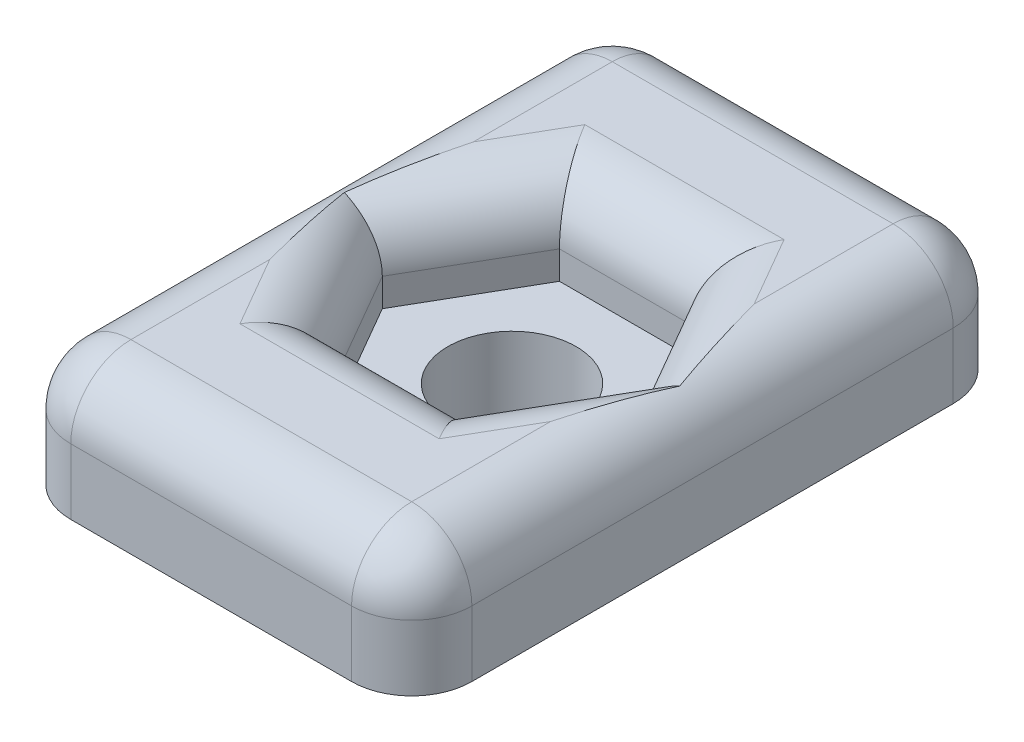
ISO-10303-21;
HEADER;
FILE_DESCRIPTION(('STEP AP214'),'2;1');
FILE_NAME('part.step','',(''),(''),'','','');
FILE_SCHEMA(('AUTOMOTIVE_DESIGN { 1 0 10303 214 1 1 1 1 }'));
ENDSEC;
DATA;
#1=APPLICATION_CONTEXT('core data for automotive mechanical design processes');
#2=APPLICATION_PROTOCOL_DEFINITION('international standard','automotive_design',2000,#1);
#3=PRODUCT_CONTEXT('',#1,'mechanical');
#4=PRODUCT('Part','Part','',(#3));
#5=PRODUCT_RELATED_PRODUCT_CATEGORY('part','',(#4));
#6=PRODUCT_DEFINITION_FORMATION('','',#4);
#7=PRODUCT_DEFINITION_CONTEXT('part definition',#1,'design');
#8=PRODUCT_DEFINITION('design','',#6,#7);
#9=PRODUCT_DEFINITION_SHAPE('','',#8);
#10=(LENGTH_UNIT() NAMED_UNIT(*) SI_UNIT(.MILLI.,.METRE.));
#11=(NAMED_UNIT(*) PLANE_ANGLE_UNIT() SI_UNIT($,.RADIAN.));
#12=(NAMED_UNIT(*) SI_UNIT($,.STERADIAN.) SOLID_ANGLE_UNIT());
#13=UNCERTAINTY_MEASURE_WITH_UNIT(LENGTH_MEASURE(1.E-05),#10,'distance_accuracy_value','');
#14=(GEOMETRIC_REPRESENTATION_CONTEXT(3) GLOBAL_UNCERTAINTY_ASSIGNED_CONTEXT((#13)) GLOBAL_UNIT_ASSIGNED_CONTEXT((#10,
#11,#12)) REPRESENTATION_CONTEXT('',''));
#15=CARTESIAN_POINT('',(0.,0.,0.));
#16=DIRECTION('',(0.,0.,1.));
#17=DIRECTION('',(1.,0.,0.));
#18=AXIS2_PLACEMENT_3D('',#15,#16,#17);
#19=CARTESIAN_POINT('',(0.,4.,0.));
#20=DIRECTION('',(0.,-1.,0.));
#21=DIRECTION('',(0.,0.,-1.));
#22=AXIS2_PLACEMENT_3D('',#19,#20,#21);
#23=PLANE('',#22);
#24=DIRECTION('',(1.,0.,0.));
#25=VECTOR('',#24,1.);
#26=CARTESIAN_POINT('',(0.,4.,-1.5));
#27=LINE('',#26,#25);
#28=CARTESIAN_POINT('',(1.5,4.,-1.5));
#29=VERTEX_POINT('',#28);
#30=CARTESIAN_POINT('',(8.5,4.,-1.5));
#31=VERTEX_POINT('',#30);
#32=EDGE_CURVE('E304',#29,#31,#27,.T.);
#33=ORIENTED_EDGE('',*,*,#32,.T.);
#34=DIRECTION('',(0.,0.,-1.));
#35=VECTOR('',#34,1.);
#36=CARTESIAN_POINT('',(8.5,4.,0.));
#37=LINE('',#36,#35);
#38=CARTESIAN_POINT('',(8.5,4.,-4.96217782649107));
#39=VERTEX_POINT('',#38);
#40=EDGE_CURVE('E307',#31,#39,#37,.T.);
#41=ORIENTED_EDGE('',*,*,#40,.T.);
#42=DIRECTION('',(0.5,0.,-0.866025403784439));
#43=VECTOR('',#42,1.);
#44=CARTESIAN_POINT('',(4.22631397208145,4.,2.4400635094611));
#45=LINE('',#44,#43);
#46=CARTESIAN_POINT('',(7.48260615751539,4.,-3.2));
#47=VERTEX_POINT('',#46);
#48=EDGE_CURVE('E292',#39,#47,#45,.F.);
#49=ORIENTED_EDGE('',*,*,#48,.T.);
#50=DIRECTION('',(1.,0.,0.));
#51=VECTOR('',#50,1.);
#52=CARTESIAN_POINT('',(0.,4.,-3.2));
#53=LINE('',#52,#51);
#54=CARTESIAN_POINT('',(2.51739384248461,4.,-3.2));
#55=VERTEX_POINT('',#54);
#56=EDGE_CURVE('E295',#47,#55,#53,.F.);
#57=ORIENTED_EDGE('',*,*,#56,.T.);
#58=DIRECTION('',(0.5,0.,0.866025403784439));
#59=VECTOR('',#58,1.);
#60=CARTESIAN_POINT('',(3.27368602791856,4.,-1.8900635094611));
#61=LINE('',#60,#59);
#62=CARTESIAN_POINT('',(1.5,4.,-4.96217782649107));
#63=VERTEX_POINT('',#62);
#64=EDGE_CURVE('E298',#55,#63,#61,.F.);
#65=ORIENTED_EDGE('',*,*,#64,.T.);
#66=DIRECTION('',(0.,0.,1.));
#67=VECTOR('',#66,1.);
#68=CARTESIAN_POINT('',(1.5,4.,0.));
#69=LINE('',#68,#67);
#70=EDGE_CURVE('E301',#63,#29,#69,.T.);
#71=ORIENTED_EDGE('',*,*,#70,.T.);
#72=EDGE_LOOP('',(#33,#41,#49,#57,#65,#71));
#73=FACE_BOUND('',#72,.T.);
#74=ADVANCED_FACE('F49',(#73),#23,.F.);
#75=CARTESIAN_POINT('',(0.,4.,0.));
#76=DIRECTION('',(1.,0.,0.));
#77=DIRECTION('',(0.,0.,-1.));
#78=AXIS2_PLACEMENT_3D('',#75,#76,#77);
#79=PLANE('',#78);
#80=DIRECTION('',(0.,-1.,0.));
#81=VECTOR('',#80,1.);
#82=CARTESIAN_POINT('',(0.,4.,-13.5));
#83=LINE('',#82,#81);
#84=CARTESIAN_POINT('',(0.,2.5,-13.5));
#85=VERTEX_POINT('',#84);
#86=CARTESIAN_POINT('',(0.,0.866025403784441,-13.5));
#87=VERTEX_POINT('',#86);
#88=EDGE_CURVE('E342',#85,#87,#83,.T.);
#89=ORIENTED_EDGE('',*,*,#88,.T.);
#90=DIRECTION('',(0.,0.,1.));
#91=VECTOR('',#90,1.);
#92=CARTESIAN_POINT('',(0.,0.866025403784441,-1.5));
#93=LINE('',#92,#91);
#94=CARTESIAN_POINT('',(0.,0.866025403784441,-1.5));
#95=VERTEX_POINT('',#94);
#96=EDGE_CURVE('E11',#87,#95,#93,.T.);
#97=ORIENTED_EDGE('',*,*,#96,.T.);
#98=DIRECTION('',(0.,-1.,0.));
#99=VECTOR('',#98,1.);
#100=CARTESIAN_POINT('',(0.,4.,-1.5));
#101=LINE('',#100,#99);
#102=CARTESIAN_POINT('',(0.,2.5,-1.5));
#103=VERTEX_POINT('',#102);
#104=EDGE_CURVE('E348',#95,#103,#101,.F.);
#105=ORIENTED_EDGE('',*,*,#104,.T.);
#106=DIRECTION('',(0.,0.,1.));
#107=VECTOR('',#106,1.);
#108=CARTESIAN_POINT('',(0.,2.5,0.));
#109=LINE('',#108,#107);
#110=EDGE_CURVE('E345',#103,#85,#109,.F.);
#111=ORIENTED_EDGE('',*,*,#110,.T.);
#112=EDGE_LOOP('',(#89,#97,#105,#111));
#113=FACE_BOUND('',#112,.T.);
#114=ADVANCED_FACE('F549',(#113),#79,.F.);
#115=CARTESIAN_POINT('',(0.,4.,0.));
#116=DIRECTION('',(0.,0.,-1.));
#117=DIRECTION('',(-1.,0.,0.));
#118=AXIS2_PLACEMENT_3D('',#115,#116,#117);
#119=PLANE('',#118);
#120=DIRECTION('',(0.,-1.,0.));
#121=VECTOR('',#120,1.);
#122=CARTESIAN_POINT('',(1.5,4.,0.));
#123=LINE('',#122,#121);
#124=CARTESIAN_POINT('',(1.5,2.5,0.));
#125=VERTEX_POINT('',#124);
#126=CARTESIAN_POINT('',(1.5,0.866025403784441,0.));
#127=VERTEX_POINT('',#126);
#128=EDGE_CURVE('E332',#125,#127,#123,.T.);
#129=ORIENTED_EDGE('',*,*,#128,.T.);
#130=DIRECTION('',(1.,0.,0.));
#131=VECTOR('',#130,1.);
#132=CARTESIAN_POINT('',(8.5,0.866025403784441,0.));
#133=LINE('',#132,#131);
#134=CARTESIAN_POINT('',(8.5,0.866025403784441,0.));
#135=VERTEX_POINT('',#134);
#136=EDGE_CURVE('E478',#127,#135,#133,.T.);
#137=ORIENTED_EDGE('',*,*,#136,.T.);
#138=DIRECTION('',(0.,-1.,0.));
#139=VECTOR('',#138,1.);
#140=CARTESIAN_POINT('',(8.5,4.,0.));
#141=LINE('',#140,#139);
#142=CARTESIAN_POINT('',(8.5,2.5,0.));
#143=VERTEX_POINT('',#142);
#144=EDGE_CURVE('E339',#135,#143,#141,.F.);
#145=ORIENTED_EDGE('',*,*,#144,.T.);
#146=DIRECTION('',(1.,0.,0.));
#147=VECTOR('',#146,1.);
#148=CARTESIAN_POINT('',(0.,2.5,0.));
#149=LINE('',#148,#147);
#150=EDGE_CURVE('E336',#143,#125,#149,.F.);
#151=ORIENTED_EDGE('',*,*,#150,.T.);
#152=EDGE_LOOP('',(#129,#137,#145,#151));
#153=FACE_BOUND('',#152,.T.);
#154=ADVANCED_FACE('F529',(#153),#119,.F.);
#155=CARTESIAN_POINT('',(10.,4.,0.));
#156=DIRECTION('',(-1.,0.,0.));
#157=DIRECTION('',(0.,0.,1.));
#158=AXIS2_PLACEMENT_3D('',#155,#156,#157);
#159=PLANE('',#158);
#160=DIRECTION('',(0.,-1.,0.));
#161=VECTOR('',#160,1.);
#162=CARTESIAN_POINT('',(10.,4.,-1.5));
#163=LINE('',#162,#161);
#164=CARTESIAN_POINT('',(10.,2.5,-1.5));
#165=VERTEX_POINT('',#164);
#166=CARTESIAN_POINT('',(10.,0.866025403784441,-1.5));
#167=VERTEX_POINT('',#166);
#168=EDGE_CURVE('E328',#165,#167,#163,.T.);
#169=ORIENTED_EDGE('',*,*,#168,.T.);
#170=DIRECTION('',(0.,0.,-1.));
#171=VECTOR('',#170,1.);
#172=CARTESIAN_POINT('',(10.,0.866025403784441,-13.5));
#173=LINE('',#172,#171);
#174=CARTESIAN_POINT('',(10.,0.866025403784441,-13.5));
#175=VERTEX_POINT('',#174);
#176=EDGE_CURVE('E369',#167,#175,#173,.T.);
#177=ORIENTED_EDGE('',*,*,#176,.T.);
#178=DIRECTION('',(0.,-1.,0.));
#179=VECTOR('',#178,1.);
#180=CARTESIAN_POINT('',(10.,4.,-13.5));
#181=LINE('',#180,#179);
#182=CARTESIAN_POINT('',(10.,2.5,-13.5));
#183=VERTEX_POINT('',#182);
#184=EDGE_CURVE('E322',#175,#183,#181,.F.);
#185=ORIENTED_EDGE('',*,*,#184,.T.);
#186=DIRECTION('',(0.,0.,-1.));
#187=VECTOR('',#186,1.);
#188=CARTESIAN_POINT('',(10.,2.5,0.));
#189=LINE('',#188,#187);
#190=EDGE_CURVE('E325',#183,#165,#189,.F.);
#191=ORIENTED_EDGE('',*,*,#190,.T.);
#192=EDGE_LOOP('',(#169,#177,#185,#191));
#193=FACE_BOUND('',#192,.T.);
#194=ADVANCED_FACE('F603',(#193),#159,.F.);
#195=CARTESIAN_POINT('',(0.,4.,-15.));
#196=DIRECTION('',(0.,0.,1.));
#197=DIRECTION('',(1.,0.,0.));
#198=AXIS2_PLACEMENT_3D('',#195,#196,#197);
#199=PLANE('',#198);
#200=DIRECTION('',(0.,-1.,0.));
#201=VECTOR('',#200,1.);
#202=CARTESIAN_POINT('',(8.5,4.,-15.));
#203=LINE('',#202,#201);
#204=CARTESIAN_POINT('',(8.5,2.5,-15.));
#205=VERTEX_POINT('',#204);
#206=CARTESIAN_POINT('',(8.5,0.866025403784441,-15.));
#207=VERTEX_POINT('',#206);
#208=EDGE_CURVE('E311',#205,#207,#203,.T.);
#209=ORIENTED_EDGE('',*,*,#208,.T.);
#210=DIRECTION('',(-1.,0.,0.));
#211=VECTOR('',#210,1.);
#212=CARTESIAN_POINT('',(1.5,0.866025403784441,-15.));
#213=LINE('',#212,#211);
#214=CARTESIAN_POINT('',(1.5,0.866025403784441,-15.));
#215=VERTEX_POINT('',#214);
#216=EDGE_CURVE('E475',#207,#215,#213,.T.);
#217=ORIENTED_EDGE('',*,*,#216,.T.);
#218=DIRECTION('',(0.,-1.,0.));
#219=VECTOR('',#218,1.);
#220=CARTESIAN_POINT('',(1.5,4.,-15.));
#221=LINE('',#220,#219);
#222=CARTESIAN_POINT('',(1.5,2.5,-15.));
#223=VERTEX_POINT('',#222);
#224=EDGE_CURVE('E319',#215,#223,#221,.F.);
#225=ORIENTED_EDGE('',*,*,#224,.T.);
#226=DIRECTION('',(-1.,0.,0.));
#227=VECTOR('',#226,1.);
#228=CARTESIAN_POINT('',(0.,2.5,-15.));
#229=LINE('',#228,#227);
#230=EDGE_CURVE('E315',#223,#205,#229,.F.);
#231=ORIENTED_EDGE('',*,*,#230,.T.);
#232=EDGE_LOOP('',(#209,#217,#225,#231));
#233=FACE_BOUND('',#232,.T.);
#234=ADVANCED_FACE('F566',(#233),#199,.F.);
#235=DIRECTION('',(-1.,0.,0.));
#236=VECTOR('',#235,1.);
#237=CARTESIAN_POINT('',(0.,4.,-13.5));
#238=LINE('',#237,#236);
#239=CARTESIAN_POINT('',(8.5,4.,-13.5));
#240=VERTEX_POINT('',#239);
#241=CARTESIAN_POINT('',(1.5,4.,-13.5));
#242=VERTEX_POINT('',#241);
#243=EDGE_CURVE('E282',#240,#242,#238,.T.);
#244=ORIENTED_EDGE('',*,*,#243,.T.);
#245=DIRECTION('',(0.,0.,1.));
#246=VECTOR('',#245,1.);
#247=CARTESIAN_POINT('',(1.5,4.,0.));
#248=LINE('',#247,#246);
#249=CARTESIAN_POINT('',(1.5,4.,-10.0378221735089));
#250=VERTEX_POINT('',#249);
#251=EDGE_CURVE('E289',#242,#250,#248,.T.);
#252=ORIENTED_EDGE('',*,*,#251,.T.);
#253=DIRECTION('',(-0.5,0.,0.866025403784439));
#254=VECTOR('',#253,1.);
#255=CARTESIAN_POINT('',(-3.22150450046473,4.,-1.8599364905389));
#256=LINE('',#255,#254);
#257=CARTESIAN_POINT('',(2.51739384248461,4.,-11.8));
#258=VERTEX_POINT('',#257);
#259=EDGE_CURVE('E286',#250,#258,#256,.F.);
#260=ORIENTED_EDGE('',*,*,#259,.T.);
#261=DIRECTION('',(-1.,0.,0.));
#262=VECTOR('',#261,1.);
#263=CARTESIAN_POINT('',(0.,4.,-11.8));
#264=LINE('',#263,#262);
#265=CARTESIAN_POINT('',(7.48260615751539,4.,-11.8));
#266=VERTEX_POINT('',#265);
#267=EDGE_CURVE('E276',#258,#266,#264,.F.);
#268=ORIENTED_EDGE('',*,*,#267,.T.);
#269=DIRECTION('',(-0.5,0.,-0.866025403784439));
#270=VECTOR('',#269,1.);
#271=CARTESIAN_POINT('',(10.7215045004647,4.,-6.19006350946109));
#272=LINE('',#271,#270);
#273=CARTESIAN_POINT('',(8.5,4.,-10.0378221735089));
#274=VERTEX_POINT('',#273);
#275=EDGE_CURVE('E259',#266,#274,#272,.F.);
#276=ORIENTED_EDGE('',*,*,#275,.T.);
#277=DIRECTION('',(0.,0.,-1.));
#278=VECTOR('',#277,1.);
#279=CARTESIAN_POINT('',(8.5,4.,0.));
#280=LINE('',#279,#278);
#281=EDGE_CURVE('E279',#274,#240,#280,.T.);
#282=ORIENTED_EDGE('',*,*,#281,.T.);
#283=EDGE_LOOP('',(#244,#252,#260,#268,#276,#282));
#284=FACE_BOUND('',#283,.T.);
#285=ADVANCED_FACE('F588',(#284),#23,.F.);
#286=CARTESIAN_POINT('',(0.,0.,0.));
#287=DIRECTION('',(0.,-1.,0.));
#288=DIRECTION('',(0.,0.,-1.));
#289=AXIS2_PLACEMENT_3D('',#286,#287,#288);
#290=PLANE('',#289);
#291=DIRECTION('',(1.,0.,0.));
#292=VECTOR('',#291,1.);
#293=CARTESIAN_POINT('',(8.5,0.,-13.5));
#294=LINE('',#293,#292);
#295=CARTESIAN_POINT('',(1.50000000000001,0.,-13.5));
#296=VERTEX_POINT('',#295);
#297=CARTESIAN_POINT('',(8.5,0.,-13.5));
#298=VERTEX_POINT('',#297);
#299=EDGE_CURVE('E462',#296,#298,#294,.T.);
#300=ORIENTED_EDGE('',*,*,#299,.T.);
#301=DIRECTION('',(0.,0.,1.));
#302=VECTOR('',#301,1.);
#303=CARTESIAN_POINT('',(8.49999999999999,0.,-1.5));
#304=LINE('',#303,#302);
#305=CARTESIAN_POINT('',(8.5,0.,-1.50000000000001));
#306=VERTEX_POINT('',#305);
#307=EDGE_CURVE('E465',#298,#306,#304,.T.);
#308=ORIENTED_EDGE('',*,*,#307,.T.);
#309=DIRECTION('',(-1.,0.,0.));
#310=VECTOR('',#309,1.);
#311=CARTESIAN_POINT('',(1.5,0.,-1.50000000000001));
#312=LINE('',#311,#310);
#313=CARTESIAN_POINT('',(1.50000000000001,0.,-1.5));
#314=VERTEX_POINT('',#313);
#315=EDGE_CURVE('E459',#306,#314,#312,.T.);
#316=ORIENTED_EDGE('',*,*,#315,.T.);
#317=DIRECTION('',(0.,0.,-1.));
#318=VECTOR('',#317,1.);
#319=CARTESIAN_POINT('',(1.50000000000001,0.,-13.5));
#320=LINE('',#319,#318);
#321=EDGE_CURVE('E456',#314,#296,#320,.T.);
#322=ORIENTED_EDGE('',*,*,#321,.T.);
#323=EDGE_LOOP('',(#300,#308,#316,#322));
#324=FACE_BOUND('',#323,.T.);
#325=CARTESIAN_POINT('',(5.,0.,-7.5));
#326=DIRECTION('',(0.,1.,0.));
#327=DIRECTION('',(0.,0.,1.));
#328=AXIS2_PLACEMENT_3D('',#325,#326,#327);
#329=CIRCLE('',#328,1.6);
#330=CARTESIAN_POINT('',(5.,0.,-5.9));
#331=VERTEX_POINT('',#330);
#332=EDGE_CURVE('E237',#331,#331,#329,.T.);
#333=ORIENTED_EDGE('',*,*,#332,.T.);
#334=EDGE_LOOP('',(#333));
#335=FACE_BOUND('',#334,.T.);
#336=ADVANCED_FACE('F576',(#324,#335),#290,.T.);
#337=CARTESIAN_POINT('',(6.61658075373095,1.8,-4.7));
#338=DIRECTION('',(0.866025403784439,0.,0.5));
#339=DIRECTION('',(0.5,0.,-0.866025403784439));
#340=AXIS2_PLACEMENT_3D('',#337,#338,#339);
#341=PLANE('',#340);
#342=DIRECTION('',(0.,1.,0.));
#343=VECTOR('',#342,1.);
#344=CARTESIAN_POINT('',(6.61658075373095,1.8,-4.7));
#345=LINE('',#344,#343);
#346=CARTESIAN_POINT('',(6.61658075373095,1.8,-4.7));
#347=VERTEX_POINT('',#346);
#348=CARTESIAN_POINT('',(6.61658075373095,2.5,-4.7));
#349=VERTEX_POINT('',#348);
#350=EDGE_CURVE('E256',#347,#349,#345,.T.);
#351=ORIENTED_EDGE('',*,*,#350,.T.);
#352=DIRECTION('',(0.5,0.,-0.866025403784439));
#353=VECTOR('',#352,1.);
#354=CARTESIAN_POINT('',(6.61658075373095,2.5,-4.7));
#355=LINE('',#354,#353);
#356=CARTESIAN_POINT('',(8.2331615074619,2.5,-7.5));
#357=VERTEX_POINT('',#356);
#358=EDGE_CURVE('E216',#349,#357,#355,.T.);
#359=ORIENTED_EDGE('',*,*,#358,.T.);
#360=DIRECTION('',(0.,1.,0.));
#361=VECTOR('',#360,1.);
#362=CARTESIAN_POINT('',(8.2331615074619,1.8,-7.5));
#363=LINE('',#362,#361);
#364=CARTESIAN_POINT('',(8.2331615074619,1.8,-7.5));
#365=VERTEX_POINT('',#364);
#366=EDGE_CURVE('E208',#365,#357,#363,.T.);
#367=ORIENTED_EDGE('',*,*,#366,.F.);
#368=DIRECTION('',(0.5,0.,-0.866025403784439));
#369=VECTOR('',#368,1.);
#370=CARTESIAN_POINT('',(6.61658075373095,1.8,-4.7));
#371=LINE('',#370,#369);
#372=EDGE_CURVE('E213',#347,#365,#371,.T.);
#373=ORIENTED_EDGE('',*,*,#372,.F.);
#374=EDGE_LOOP('',(#351,#359,#367,#373));
#375=FACE_BOUND('',#374,.T.);
#376=ADVANCED_FACE('F211',(#375),#341,.F.);
#377=CARTESIAN_POINT('',(3.38341924626905,1.8,-4.7));
#378=DIRECTION('',(0.,0.,1.));
#379=DIRECTION('',(1.,0.,0.));
#380=AXIS2_PLACEMENT_3D('',#377,#378,#379);
#381=PLANE('',#380);
#382=DIRECTION('',(0.,1.,0.));
#383=VECTOR('',#382,1.);
#384=CARTESIAN_POINT('',(3.38341924626905,1.8,-4.7));
#385=LINE('',#384,#383);
#386=CARTESIAN_POINT('',(3.38341924626905,1.8,-4.7));
#387=VERTEX_POINT('',#386);
#388=CARTESIAN_POINT('',(3.38341924626905,2.5,-4.7));
#389=VERTEX_POINT('',#388);
#390=EDGE_CURVE('E260',#387,#389,#385,.T.);
#391=ORIENTED_EDGE('',*,*,#390,.T.);
#392=DIRECTION('',(1.,0.,0.));
#393=VECTOR('',#392,1.);
#394=CARTESIAN_POINT('',(3.38341924626905,2.5,-4.7));
#395=LINE('',#394,#393);
#396=EDGE_CURVE('E361',#389,#349,#395,.T.);
#397=ORIENTED_EDGE('',*,*,#396,.T.);
#398=ORIENTED_EDGE('',*,*,#350,.F.);
#399=DIRECTION('',(1.,0.,0.));
#400=VECTOR('',#399,1.);
#401=CARTESIAN_POINT('',(3.38341924626905,1.8,-4.7));
#402=LINE('',#401,#400);
#403=EDGE_CURVE('E221',#387,#347,#402,.T.);
#404=ORIENTED_EDGE('',*,*,#403,.F.);
#405=EDGE_LOOP('',(#391,#397,#398,#404));
#406=FACE_BOUND('',#405,.T.);
#407=ADVANCED_FACE('F847',(#406),#381,.F.);
#408=CARTESIAN_POINT('',(1.76683849253809,1.8,-7.5));
#409=DIRECTION('',(-0.866025403784439,0.,0.5));
#410=DIRECTION('',(0.5,0.,0.866025403784439));
#411=AXIS2_PLACEMENT_3D('',#408,#409,#410);
#412=PLANE('',#411);
#413=DIRECTION('',(0.,1.,0.));
#414=VECTOR('',#413,1.);
#415=CARTESIAN_POINT('',(1.76683849253809,1.8,-7.5));
#416=LINE('',#415,#414);
#417=CARTESIAN_POINT('',(1.76683849253809,1.8,-7.5));
#418=VERTEX_POINT('',#417);
#419=CARTESIAN_POINT('',(1.76683849253809,2.5,-7.5));
#420=VERTEX_POINT('',#419);
#421=EDGE_CURVE('E264',#418,#420,#416,.T.);
#422=ORIENTED_EDGE('',*,*,#421,.T.);
#423=DIRECTION('',(0.5,0.,0.866025403784439));
#424=VECTOR('',#423,1.);
#425=CARTESIAN_POINT('',(1.76683849253809,2.5,-7.5));
#426=LINE('',#425,#424);
#427=EDGE_CURVE('E358',#420,#389,#426,.T.);
#428=ORIENTED_EDGE('',*,*,#427,.T.);
#429=ORIENTED_EDGE('',*,*,#390,.F.);
#430=DIRECTION('',(0.5,0.,0.866025403784439));
#431=VECTOR('',#430,1.);
#432=CARTESIAN_POINT('',(1.76683849253809,1.8,-7.5));
#433=LINE('',#432,#431);
#434=EDGE_CURVE('E251',#418,#387,#433,.T.);
#435=ORIENTED_EDGE('',*,*,#434,.F.);
#436=EDGE_LOOP('',(#422,#428,#429,#435));
#437=FACE_BOUND('',#436,.T.);
#438=ADVANCED_FACE('F854',(#437),#412,.F.);
#439=CARTESIAN_POINT('',(3.38341924626905,1.8,-10.3));
#440=DIRECTION('',(-0.866025403784439,0.,-0.5));
#441=DIRECTION('',(-0.5,0.,0.866025403784439));
#442=AXIS2_PLACEMENT_3D('',#439,#440,#441);
#443=PLANE('',#442);
#444=DIRECTION('',(0.,1.,0.));
#445=VECTOR('',#444,1.);
#446=CARTESIAN_POINT('',(3.38341924626905,1.8,-10.3));
#447=LINE('',#446,#445);
#448=CARTESIAN_POINT('',(3.38341924626905,1.8,-10.3));
#449=VERTEX_POINT('',#448);
#450=CARTESIAN_POINT('',(3.38341924626905,2.5,-10.3));
#451=VERTEX_POINT('',#450);
#452=EDGE_CURVE('E268',#449,#451,#447,.T.);
#453=ORIENTED_EDGE('',*,*,#452,.T.);
#454=DIRECTION('',(-0.5,0.,0.866025403784439));
#455=VECTOR('',#454,1.);
#456=CARTESIAN_POINT('',(3.38341924626905,2.5,-10.3));
#457=LINE('',#456,#455);
#458=EDGE_CURVE('E355',#451,#420,#457,.T.);
#459=ORIENTED_EDGE('',*,*,#458,.T.);
#460=ORIENTED_EDGE('',*,*,#421,.F.);
#461=DIRECTION('',(-0.5,0.,0.866025403784439));
#462=VECTOR('',#461,1.);
#463=CARTESIAN_POINT('',(3.38341924626905,1.8,-10.3));
#464=LINE('',#463,#462);
#465=EDGE_CURVE('E247',#449,#418,#464,.T.);
#466=ORIENTED_EDGE('',*,*,#465,.F.);
#467=EDGE_LOOP('',(#453,#459,#460,#466));
#468=FACE_BOUND('',#467,.T.);
#469=ADVANCED_FACE('F863',(#468),#443,.F.);
#470=CARTESIAN_POINT('',(6.61658075373095,1.8,-10.3));
#471=DIRECTION('',(0.,0.,-1.));
#472=DIRECTION('',(-1.,0.,0.));
#473=AXIS2_PLACEMENT_3D('',#470,#471,#472);
#474=PLANE('',#473);
#475=DIRECTION('',(0.,1.,0.));
#476=VECTOR('',#475,1.);
#477=CARTESIAN_POINT('',(6.61658075373095,1.8,-10.3));
#478=LINE('',#477,#476);
#479=CARTESIAN_POINT('',(6.61658075373095,1.8,-10.3));
#480=VERTEX_POINT('',#479);
#481=CARTESIAN_POINT('',(6.61658075373095,2.5,-10.3));
#482=VERTEX_POINT('',#481);
#483=EDGE_CURVE('E220',#480,#482,#478,.T.);
#484=ORIENTED_EDGE('',*,*,#483,.T.);
#485=DIRECTION('',(-1.,0.,0.));
#486=VECTOR('',#485,1.);
#487=CARTESIAN_POINT('',(6.61658075373095,2.5,-10.3));
#488=LINE('',#487,#486);
#489=EDGE_CURVE('E351',#482,#451,#488,.T.);
#490=ORIENTED_EDGE('',*,*,#489,.T.);
#491=ORIENTED_EDGE('',*,*,#452,.F.);
#492=DIRECTION('',(-1.,0.,0.));
#493=VECTOR('',#492,1.);
#494=CARTESIAN_POINT('',(6.61658075373095,1.8,-10.3));
#495=LINE('',#494,#493);
#496=EDGE_CURVE('E231',#480,#449,#495,.T.);
#497=ORIENTED_EDGE('',*,*,#496,.F.);
#498=EDGE_LOOP('',(#484,#490,#491,#497));
#499=FACE_BOUND('',#498,.T.);
#500=ADVANCED_FACE('F872',(#499),#474,.F.);
#501=CARTESIAN_POINT('',(8.2331615074619,1.8,-7.5));
#502=DIRECTION('',(0.866025403784439,0.,-0.5));
#503=DIRECTION('',(-0.5,0.,-0.866025403784439));
#504=AXIS2_PLACEMENT_3D('',#501,#502,#503);
#505=PLANE('',#504);
#506=ORIENTED_EDGE('',*,*,#366,.T.);
#507=DIRECTION('',(-0.5,0.,-0.866025403784439));
#508=VECTOR('',#507,1.);
#509=CARTESIAN_POINT('',(8.2331615074619,2.5,-7.5));
#510=LINE('',#509,#508);
#511=EDGE_CURVE('E366',#357,#482,#510,.T.);
#512=ORIENTED_EDGE('',*,*,#511,.T.);
#513=ORIENTED_EDGE('',*,*,#483,.F.);
#514=DIRECTION('',(-0.5,0.,-0.866025403784439));
#515=VECTOR('',#514,1.);
#516=CARTESIAN_POINT('',(8.2331615074619,1.8,-7.5));
#517=LINE('',#516,#515);
#518=EDGE_CURVE('E224',#365,#480,#517,.T.);
#519=ORIENTED_EDGE('',*,*,#518,.F.);
#520=EDGE_LOOP('',(#506,#512,#513,#519));
#521=FACE_BOUND('',#520,.T.);
#522=ADVANCED_FACE('F225',(#521),#505,.F.);
#523=CARTESIAN_POINT('',(0.,1.8,0.));
#524=DIRECTION('',(0.,1.,0.));
#525=DIRECTION('',(0.,0.,1.));
#526=AXIS2_PLACEMENT_3D('',#523,#524,#525);
#527=PLANE('',#526);
#528=CARTESIAN_POINT('',(5.,1.8,-7.5));
#529=DIRECTION('',(0.,1.,0.));
#530=DIRECTION('',(0.,0.,1.));
#531=AXIS2_PLACEMENT_3D('',#528,#529,#530);
#532=CIRCLE('',#531,1.59999999999999);
#533=CARTESIAN_POINT('',(5.,1.8,-5.90000000000001));
#534=VERTEX_POINT('',#533);
#535=EDGE_CURVE('E241',#534,#534,#532,.T.);
#536=ORIENTED_EDGE('',*,*,#535,.F.);
#537=EDGE_LOOP('',(#536));
#538=FACE_BOUND('',#537,.T.);
#539=ORIENTED_EDGE('',*,*,#372,.T.);
#540=ORIENTED_EDGE('',*,*,#518,.T.);
#541=ORIENTED_EDGE('',*,*,#496,.T.);
#542=ORIENTED_EDGE('',*,*,#465,.T.);
#543=ORIENTED_EDGE('',*,*,#434,.T.);
#544=ORIENTED_EDGE('',*,*,#403,.T.);
#545=EDGE_LOOP('',(#539,#540,#541,#542,#543,#544));
#546=FACE_BOUND('',#545,.T.);
#547=ADVANCED_FACE('F233',(#538,#546),#527,.T.);
#548=CARTESIAN_POINT('',(5.,1.8,-7.5));
#549=DIRECTION('',(0.,1.,0.));
#550=DIRECTION('',(0.,0.,1.));
#551=AXIS2_PLACEMENT_3D('',#548,#549,#550);
#552=CYLINDRICAL_SURFACE('',#551,1.59999999999999);
#553=ORIENTED_EDGE('',*,*,#332,.F.);
#554=EDGE_LOOP('',(#553));
#555=FACE_BOUND('',#554,.T.);
#556=ORIENTED_EDGE('',*,*,#535,.T.);
#557=EDGE_LOOP('',(#556));
#558=FACE_BOUND('',#557,.T.);
#559=ADVANCED_FACE('F706',(#555,#558),#552,.F.);
#560=CARTESIAN_POINT('',(6.61658075373095,2.5,-11.8));
#561=DIRECTION('',(-1.,0.,0.));
#562=DIRECTION('',(0.,0.,1.));
#563=AXIS2_PLACEMENT_3D('',#560,#561,#562);
#564=CYLINDRICAL_SURFACE('',#563,1.5);
#565=CARTESIAN_POINT('',(2.51739384248461,2.5,-11.8));
#566=DIRECTION('',(-0.866025403784439,0.,0.5));
#567=DIRECTION('',(-0.5,0.,-0.866025403784439));
#568=AXIS2_PLACEMENT_3D('',#565,#566,#567);
#569=ELLIPSE('',#568,1.73205080756888,1.5);
#570=EDGE_CURVE('E430',#451,#258,#569,.T.);
#571=ORIENTED_EDGE('',*,*,#570,.F.);
#572=ORIENTED_EDGE('',*,*,#489,.F.);
#573=CARTESIAN_POINT('',(7.48260615751539,2.5,-11.8));
#574=DIRECTION('',(-0.866025403784439,0.,-0.5));
#575=DIRECTION('',(-0.5,0.,0.866025403784439));
#576=AXIS2_PLACEMENT_3D('',#573,#574,#575);
#577=ELLIPSE('',#576,1.73205080756888,1.5);
#578=EDGE_CURVE('E434',#266,#482,#577,.F.);
#579=ORIENTED_EDGE('',*,*,#578,.F.);
#580=ORIENTED_EDGE('',*,*,#267,.F.);
#581=EDGE_LOOP('',(#571,#572,#579,#580));
#582=FACE_BOUND('',#581,.T.);
#583=ADVANCED_FACE('F703',(#582),#564,.T.);
#584=CARTESIAN_POINT('',(3.38341924626905,2.5,-3.2));
#585=DIRECTION('',(1.,0.,0.));
#586=DIRECTION('',(0.,0.,-1.));
#587=AXIS2_PLACEMENT_3D('',#584,#585,#586);
#588=CYLINDRICAL_SURFACE('',#587,1.5);
#589=CARTESIAN_POINT('',(2.51739384248461,2.5,-3.2));
#590=DIRECTION('',(0.866025403784439,0.,0.5));
#591=DIRECTION('',(-0.5,0.,0.866025403784439));
#592=AXIS2_PLACEMENT_3D('',#589,#590,#591);
#593=ELLIPSE('',#592,1.73205080756888,1.5);
#594=EDGE_CURVE('E423',#55,#389,#593,.F.);
#595=ORIENTED_EDGE('',*,*,#594,.F.);
#596=ORIENTED_EDGE('',*,*,#56,.F.);
#597=CARTESIAN_POINT('',(7.48260615751539,2.5,-3.2));
#598=DIRECTION('',(0.866025403784438,0.,-0.5));
#599=DIRECTION('',(0.5,0.,0.866025403784439));
#600=AXIS2_PLACEMENT_3D('',#597,#598,#599);
#601=ELLIPSE('',#600,1.73205080756888,1.5);
#602=EDGE_CURVE('E441',#349,#47,#601,.T.);
#603=ORIENTED_EDGE('',*,*,#602,.F.);
#604=ORIENTED_EDGE('',*,*,#396,.F.);
#605=EDGE_LOOP('',(#595,#596,#603,#604));
#606=FACE_BOUND('',#605,.T.);
#607=ADVANCED_FACE('F702',(#606),#588,.T.);
#608=CARTESIAN_POINT('',(8.5,4.,-1.5));
#609=DIRECTION('',(0.,-1.,0.));
#610=DIRECTION('',(0.,0.,-1.));
#611=AXIS2_PLACEMENT_3D('',#608,#609,#610);
#612=CYLINDRICAL_SURFACE('',#611,1.5);
#613=ORIENTED_EDGE('',*,*,#144,.F.);
#614=CARTESIAN_POINT('',(8.5,0.866025403784441,-1.5));
#615=DIRECTION('',(0.,-1.,0.));
#616=DIRECTION('',(0.,0.,-1.));
#617=AXIS2_PLACEMENT_3D('',#614,#615,#616);
#618=CIRCLE('',#617,1.5);
#619=EDGE_CURVE('E472',#135,#167,#618,.F.);
#620=ORIENTED_EDGE('',*,*,#619,.T.);
#621=ORIENTED_EDGE('',*,*,#168,.F.);
#622=CARTESIAN_POINT('',(8.5,2.5,-1.5));
#623=DIRECTION('',(0.,1.,0.));
#624=DIRECTION('',(0.,0.,1.));
#625=AXIS2_PLACEMENT_3D('',#622,#623,#624);
#626=CIRCLE('',#625,1.5);
#627=EDGE_CURVE('E449',#143,#165,#626,.T.);
#628=ORIENTED_EDGE('',*,*,#627,.F.);
#629=EDGE_LOOP('',(#613,#620,#621,#628));
#630=FACE_BOUND('',#629,.T.);
#631=ADVANCED_FACE('F534',(#630),#612,.T.);
#632=CARTESIAN_POINT('',(0.,2.5,-1.5));
#633=DIRECTION('',(1.,0.,0.));
#634=DIRECTION('',(0.,0.,-1.));
#635=AXIS2_PLACEMENT_3D('',#632,#633,#634);
#636=CYLINDRICAL_SURFACE('',#635,1.5);
#637=CARTESIAN_POINT('',(1.5,2.5,-1.5));
#638=DIRECTION('',(-1.,0.,0.));
#639=DIRECTION('',(0.,0.,1.));
#640=AXIS2_PLACEMENT_3D('',#637,#638,#639);
#641=CIRCLE('',#640,1.5);
#642=EDGE_CURVE('E419',#125,#29,#641,.T.);
#643=ORIENTED_EDGE('',*,*,#642,.F.);
#644=ORIENTED_EDGE('',*,*,#150,.F.);
#645=CARTESIAN_POINT('',(8.5,2.5,-1.5));
#646=DIRECTION('',(1.,0.,0.));
#647=DIRECTION('',(0.,0.,-1.));
#648=AXIS2_PLACEMENT_3D('',#645,#646,#647);
#649=CIRCLE('',#648,1.5);
#650=EDGE_CURVE('E445',#31,#143,#649,.T.);
#651=ORIENTED_EDGE('',*,*,#650,.F.);
#652=ORIENTED_EDGE('',*,*,#32,.F.);
#653=EDGE_LOOP('',(#643,#644,#651,#652));
#654=FACE_BOUND('',#653,.T.);
#655=ADVANCED_FACE('F544',(#654),#636,.T.);
#656=CARTESIAN_POINT('',(1.5,4.,-1.5));
#657=DIRECTION('',(0.,-1.,0.));
#658=DIRECTION('',(0.,0.,-1.));
#659=AXIS2_PLACEMENT_3D('',#656,#657,#658);
#660=CYLINDRICAL_SURFACE('',#659,1.5);
#661=ORIENTED_EDGE('',*,*,#104,.F.);
#662=CARTESIAN_POINT('',(1.5,0.866025403784441,-1.5));
#663=DIRECTION('',(0.,-1.,0.));
#664=DIRECTION('',(0.,0.,-1.));
#665=AXIS2_PLACEMENT_3D('',#662,#663,#664);
#666=CIRCLE('',#665,1.5);
#667=EDGE_CURVE('E60',#95,#127,#666,.F.);
#668=ORIENTED_EDGE('',*,*,#667,.T.);
#669=ORIENTED_EDGE('',*,*,#128,.F.);
#670=CARTESIAN_POINT('',(1.5,2.5,-1.5));
#671=DIRECTION('',(0.,1.,0.));
#672=DIRECTION('',(0.,0.,1.));
#673=AXIS2_PLACEMENT_3D('',#670,#671,#672);
#674=CIRCLE('',#673,1.5);
#675=EDGE_CURVE('E415',#103,#125,#674,.T.);
#676=ORIENTED_EDGE('',*,*,#675,.F.);
#677=EDGE_LOOP('',(#661,#668,#669,#676));
#678=FACE_BOUND('',#677,.T.);
#679=ADVANCED_FACE('F547',(#678),#660,.T.);
#680=CARTESIAN_POINT('',(8.5,2.5,-1.5));
#681=DIRECTION('',(0.,0.,1.));
#682=DIRECTION('',(1.,0.,0.));
#683=AXIS2_PLACEMENT_3D('',#680,#681,#682);
#684=SPHERICAL_SURFACE('',#683,1.5);
#685=ORIENTED_EDGE('',*,*,#650,.T.);
#686=ORIENTED_EDGE('',*,*,#627,.T.);
#687=CARTESIAN_POINT('',(8.5,2.5,-1.5));
#688=DIRECTION('',(0.,0.,1.));
#689=DIRECTION('',(1.,0.,0.));
#690=AXIS2_PLACEMENT_3D('',#687,#688,#689);
#691=CIRCLE('',#690,1.5);
#692=EDGE_CURVE('E411',#31,#165,#691,.F.);
#693=ORIENTED_EDGE('',*,*,#692,.F.);
#694=EDGE_LOOP('',(#685,#686,#693));
#695=FACE_BOUND('',#694,.T.);
#696=ADVANCED_FACE('F539',(#695),#684,.T.);
#697=CARTESIAN_POINT('',(7.91561885940761,2.5,-3.95));
#698=DIRECTION('',(0.5,0.,-0.866025403784439));
#699=DIRECTION('',(-0.866025403784439,0.,-0.5));
#700=AXIS2_PLACEMENT_3D('',#697,#698,#699);
#701=CYLINDRICAL_SURFACE('',#700,1.5);
#702=CARTESIAN_POINT('',(9.96521231503078,2.5,-7.5));
#703=DIRECTION('',(0.,0.,-1.));
#704=DIRECTION('',(1.,0.,0.));
#705=AXIS2_PLACEMENT_3D('',#702,#703,#704);
#706=ELLIPSE('',#705,1.73205080756888,1.5);
#707=CARTESIAN_POINT('',(9.18000740192551,3.83700782844623,-7.5));
#708=VERTEX_POINT('',#707);
#709=EDGE_CURVE('E438',#357,#708,#706,.T.);
#710=ORIENTED_EDGE('',*,*,#709,.F.);
#711=ORIENTED_EDGE('',*,*,#358,.F.);
#712=ORIENTED_EDGE('',*,*,#602,.T.);
#713=ORIENTED_EDGE('',*,*,#48,.F.);
#714=CARTESIAN_POINT('',(8.5,2.5,-4.96217782649107));
#715=DIRECTION('',(-0.965925826289068,0.,-0.25881904510252));
#716=DIRECTION('',(0.25881904510252,0.,-0.965925826289068));
#717=AXIS2_PLACEMENT_3D('',#714,#715,#716);
#718=ELLIPSE('',#717,5.79555495773441,1.5);
#719=EDGE_CURVE('E408',#708,#39,#718,.F.);
#720=ORIENTED_EDGE('',*,*,#719,.F.);
#721=EDGE_LOOP('',(#710,#711,#712,#713,#720));
#722=FACE_BOUND('',#721,.T.);
#723=ADVANCED_FACE('F717',(#722),#701,.T.);
#724=CARTESIAN_POINT('',(9.53219961313856,2.5,-8.25));
#725=DIRECTION('',(-0.5,0.,-0.866025403784439));
#726=DIRECTION('',(-0.866025403784439,0.,0.5));
#727=AXIS2_PLACEMENT_3D('',#724,#725,#726);
#728=CYLINDRICAL_SURFACE('',#727,1.5);
#729=ORIENTED_EDGE('',*,*,#511,.F.);
#730=ORIENTED_EDGE('',*,*,#709,.T.);
#731=CARTESIAN_POINT('',(8.5,2.5,-10.0378221735089));
#732=DIRECTION('',(0.965925826289068,0.,-0.258819045102521));
#733=DIRECTION('',(-0.258819045102521,0.,-0.965925826289068));
#734=AXIS2_PLACEMENT_3D('',#731,#732,#733);
#735=ELLIPSE('',#734,5.79555495773442,1.5);
#736=EDGE_CURVE('E404',#274,#708,#735,.T.);
#737=ORIENTED_EDGE('',*,*,#736,.F.);
#738=ORIENTED_EDGE('',*,*,#275,.F.);
#739=ORIENTED_EDGE('',*,*,#578,.T.);
#740=EDGE_LOOP('',(#729,#730,#737,#738,#739));
#741=FACE_BOUND('',#740,.T.);
#742=ADVANCED_FACE('F720',(#741),#728,.T.);
#743=CARTESIAN_POINT('',(2.08438114059239,2.5,-11.05));
#744=DIRECTION('',(-0.5,0.,0.866025403784439));
#745=DIRECTION('',(0.866025403784439,0.,0.5));
#746=AXIS2_PLACEMENT_3D('',#743,#744,#745);
#747=CYLINDRICAL_SURFACE('',#746,1.5);
#748=CARTESIAN_POINT('',(0.0347876849692168,2.5,-7.5));
#749=DIRECTION('',(0.,0.,1.));
#750=DIRECTION('',(-1.,0.,0.));
#751=AXIS2_PLACEMENT_3D('',#748,#749,#750);
#752=ELLIPSE('',#751,1.73205080756888,1.5);
#753=CARTESIAN_POINT('',(0.819992598074484,3.83700782844623,-7.5));
#754=VERTEX_POINT('',#753);
#755=EDGE_CURVE('E427',#420,#754,#752,.T.);
#756=ORIENTED_EDGE('',*,*,#755,.F.);
#757=ORIENTED_EDGE('',*,*,#458,.F.);
#758=ORIENTED_EDGE('',*,*,#570,.T.);
#759=ORIENTED_EDGE('',*,*,#259,.F.);
#760=CARTESIAN_POINT('',(1.5,2.5,-10.0378221735089));
#761=DIRECTION('',(0.965925826289068,0.,0.25881904510252));
#762=DIRECTION('',(-0.258819045102521,0.,0.965925826289068));
#763=AXIS2_PLACEMENT_3D('',#760,#761,#762);
#764=ELLIPSE('',#763,5.79555495773441,1.5);
#765=EDGE_CURVE('E400',#754,#250,#764,.F.);
#766=ORIENTED_EDGE('',*,*,#765,.F.);
#767=EDGE_LOOP('',(#756,#757,#758,#759,#766));
#768=FACE_BOUND('',#767,.T.);
#769=ADVANCED_FACE('F724',(#768),#747,.T.);
#770=CARTESIAN_POINT('',(0.467800386861436,2.5,-6.75));
#771=DIRECTION('',(0.5,0.,0.866025403784439));
#772=DIRECTION('',(0.866025403784439,0.,-0.5));
#773=AXIS2_PLACEMENT_3D('',#770,#771,#772);
#774=CYLINDRICAL_SURFACE('',#773,1.5);
#775=ORIENTED_EDGE('',*,*,#427,.F.);
#776=ORIENTED_EDGE('',*,*,#755,.T.);
#777=CARTESIAN_POINT('',(1.5,2.5,-4.96217782649107));
#778=DIRECTION('',(-0.965925826289068,0.,0.258819045102521));
#779=DIRECTION('',(0.258819045102521,0.,0.965925826289068));
#780=AXIS2_PLACEMENT_3D('',#777,#778,#779);
#781=ELLIPSE('',#780,5.79555495773441,1.5);
#782=EDGE_CURVE('E396',#63,#754,#781,.T.);
#783=ORIENTED_EDGE('',*,*,#782,.F.);
#784=ORIENTED_EDGE('',*,*,#64,.F.);
#785=ORIENTED_EDGE('',*,*,#594,.T.);
#786=EDGE_LOOP('',(#775,#776,#783,#784,#785));
#787=FACE_BOUND('',#786,.T.);
#788=ADVANCED_FACE('F728',(#787),#774,.T.);
#789=CARTESIAN_POINT('',(1.5,2.5,-1.5));
#790=DIRECTION('',(0.,0.,1.));
#791=DIRECTION('',(1.,0.,0.));
#792=AXIS2_PLACEMENT_3D('',#789,#790,#791);
#793=SPHERICAL_SURFACE('',#792,1.5);
#794=ORIENTED_EDGE('',*,*,#675,.T.);
#795=ORIENTED_EDGE('',*,*,#642,.T.);
#796=CARTESIAN_POINT('',(1.5,2.5,-1.5));
#797=DIRECTION('',(0.,0.,1.));
#798=DIRECTION('',(1.,0.,0.));
#799=AXIS2_PLACEMENT_3D('',#796,#797,#798);
#800=CIRCLE('',#799,1.5);
#801=EDGE_CURVE('E392',#103,#29,#800,.F.);
#802=ORIENTED_EDGE('',*,*,#801,.F.);
#803=EDGE_LOOP('',(#794,#795,#802));
#804=FACE_BOUND('',#803,.T.);
#805=ADVANCED_FACE('F732',(#804),#793,.T.);
#806=CARTESIAN_POINT('',(8.5,4.,-13.5));
#807=DIRECTION('',(0.,-1.,0.));
#808=DIRECTION('',(0.,0.,-1.));
#809=AXIS2_PLACEMENT_3D('',#806,#807,#808);
#810=CYLINDRICAL_SURFACE('',#809,1.5);
#811=ORIENTED_EDGE('',*,*,#184,.F.);
#812=CARTESIAN_POINT('',(8.5,0.866025403784441,-13.5));
#813=DIRECTION('',(0.,-1.,0.));
#814=DIRECTION('',(0.,0.,-1.));
#815=AXIS2_PLACEMENT_3D('',#812,#813,#814);
#816=CIRCLE('',#815,1.5);
#817=EDGE_CURVE('E469',#175,#207,#816,.F.);
#818=ORIENTED_EDGE('',*,*,#817,.T.);
#819=ORIENTED_EDGE('',*,*,#208,.F.);
#820=CARTESIAN_POINT('',(8.5,2.5,-13.5));
#821=DIRECTION('',(0.,1.,0.));
#822=DIRECTION('',(0.,0.,1.));
#823=AXIS2_PLACEMENT_3D('',#820,#821,#822);
#824=CIRCLE('',#823,1.5);
#825=EDGE_CURVE('E388',#183,#205,#824,.T.);
#826=ORIENTED_EDGE('',*,*,#825,.F.);
#827=EDGE_LOOP('',(#811,#818,#819,#826));
#828=FACE_BOUND('',#827,.T.);
#829=ADVANCED_FACE('F618',(#828),#810,.T.);
#830=CARTESIAN_POINT('',(8.5,2.5,0.));
#831=DIRECTION('',(0.,0.,-1.));
#832=DIRECTION('',(-1.,0.,0.));
#833=AXIS2_PLACEMENT_3D('',#830,#831,#832);
#834=CYLINDRICAL_SURFACE('',#833,1.5);
#835=ORIENTED_EDGE('',*,*,#692,.T.);
#836=ORIENTED_EDGE('',*,*,#190,.F.);
#837=CARTESIAN_POINT('',(8.5,2.5,-13.5));
#838=DIRECTION('',(0.,0.,-1.));
#839=DIRECTION('',(-1.,0.,0.));
#840=AXIS2_PLACEMENT_3D('',#837,#838,#839);
#841=CIRCLE('',#840,1.5);
#842=EDGE_CURVE('E384',#240,#183,#841,.T.);
#843=ORIENTED_EDGE('',*,*,#842,.F.);
#844=ORIENTED_EDGE('',*,*,#281,.F.);
#845=ORIENTED_EDGE('',*,*,#736,.T.);
#846=ORIENTED_EDGE('',*,*,#719,.T.);
#847=ORIENTED_EDGE('',*,*,#40,.F.);
#848=EDGE_LOOP('',(#835,#836,#843,#844,#845,#846,#847));
#849=FACE_BOUND('',#848,.T.);
#850=ADVANCED_FACE('F612',(#849),#834,.T.);
#851=CARTESIAN_POINT('',(1.5,2.5,0.));
#852=DIRECTION('',(0.,0.,1.));
#853=DIRECTION('',(1.,0.,0.));
#854=AXIS2_PLACEMENT_3D('',#851,#852,#853);
#855=CYLINDRICAL_SURFACE('',#854,1.5);
#856=ORIENTED_EDGE('',*,*,#765,.T.);
#857=ORIENTED_EDGE('',*,*,#251,.F.);
#858=CARTESIAN_POINT('',(1.5,2.5,-13.5));
#859=DIRECTION('',(0.,0.,-1.));
#860=DIRECTION('',(-1.,0.,0.));
#861=AXIS2_PLACEMENT_3D('',#858,#859,#860);
#862=CIRCLE('',#861,1.5);
#863=EDGE_CURVE('E380',#85,#242,#862,.T.);
#864=ORIENTED_EDGE('',*,*,#863,.F.);
#865=ORIENTED_EDGE('',*,*,#110,.F.);
#866=ORIENTED_EDGE('',*,*,#801,.T.);
#867=ORIENTED_EDGE('',*,*,#70,.F.);
#868=ORIENTED_EDGE('',*,*,#782,.T.);
#869=EDGE_LOOP('',(#856,#857,#864,#865,#866,#867,#868));
#870=FACE_BOUND('',#869,.T.);
#871=ADVANCED_FACE('F557',(#870),#855,.T.);
#872=CARTESIAN_POINT('',(1.5,4.,-13.5));
#873=DIRECTION('',(0.,-1.,0.));
#874=DIRECTION('',(0.,0.,-1.));
#875=AXIS2_PLACEMENT_3D('',#872,#873,#874);
#876=CYLINDRICAL_SURFACE('',#875,1.5);
#877=ORIENTED_EDGE('',*,*,#224,.F.);
#878=CARTESIAN_POINT('',(1.5,0.866025403784441,-13.5));
#879=DIRECTION('',(0.,-1.,0.));
#880=DIRECTION('',(0.,0.,-1.));
#881=AXIS2_PLACEMENT_3D('',#878,#879,#880);
#882=CIRCLE('',#881,1.5);
#883=EDGE_CURVE('E74',#215,#87,#882,.F.);
#884=ORIENTED_EDGE('',*,*,#883,.T.);
#885=ORIENTED_EDGE('',*,*,#88,.F.);
#886=CARTESIAN_POINT('',(1.5,2.5,-13.5));
#887=DIRECTION('',(0.,1.,0.));
#888=DIRECTION('',(0.,0.,1.));
#889=AXIS2_PLACEMENT_3D('',#886,#887,#888);
#890=CIRCLE('',#889,1.5);
#891=EDGE_CURVE('E376',#223,#85,#890,.T.);
#892=ORIENTED_EDGE('',*,*,#891,.F.);
#893=EDGE_LOOP('',(#877,#884,#885,#892));
#894=FACE_BOUND('',#893,.T.);
#895=ADVANCED_FACE('F554',(#894),#876,.T.);
#896=CARTESIAN_POINT('',(8.5,2.5,-13.5));
#897=DIRECTION('',(1.,0.,0.));
#898=DIRECTION('',(0.,0.,-1.));
#899=AXIS2_PLACEMENT_3D('',#896,#897,#898);
#900=SPHERICAL_SURFACE('',#899,1.5);
#901=ORIENTED_EDGE('',*,*,#842,.T.);
#902=ORIENTED_EDGE('',*,*,#825,.T.);
#903=CARTESIAN_POINT('',(8.5,2.5,-13.5));
#904=DIRECTION('',(1.,0.,0.));
#905=DIRECTION('',(0.,0.,-1.));
#906=AXIS2_PLACEMENT_3D('',#903,#904,#905);
#907=CIRCLE('',#906,1.5);
#908=EDGE_CURVE('E373',#240,#205,#907,.F.);
#909=ORIENTED_EDGE('',*,*,#908,.F.);
#910=EDGE_LOOP('',(#901,#902,#909));
#911=FACE_BOUND('',#910,.T.);
#912=ADVANCED_FACE('F615',(#911),#900,.T.);
#913=CARTESIAN_POINT('',(1.5,2.5,-13.5));
#914=DIRECTION('',(-1.,0.,0.));
#915=DIRECTION('',(0.,0.,1.));
#916=AXIS2_PLACEMENT_3D('',#913,#914,#915);
#917=SPHERICAL_SURFACE('',#916,1.5);
#918=ORIENTED_EDGE('',*,*,#891,.T.);
#919=ORIENTED_EDGE('',*,*,#863,.T.);
#920=CARTESIAN_POINT('',(1.5,2.5,-13.5));
#921=DIRECTION('',(-1.,0.,0.));
#922=DIRECTION('',(0.,0.,1.));
#923=AXIS2_PLACEMENT_3D('',#920,#921,#922);
#924=CIRCLE('',#923,1.5);
#925=EDGE_CURVE('E370',#223,#242,#924,.F.);
#926=ORIENTED_EDGE('',*,*,#925,.F.);
#927=EDGE_LOOP('',(#918,#919,#926));
#928=FACE_BOUND('',#927,.T.);
#929=ADVANCED_FACE('F560',(#928),#917,.T.);
#930=CARTESIAN_POINT('',(0.,2.5,-13.5));
#931=DIRECTION('',(-1.,0.,0.));
#932=DIRECTION('',(0.,0.,1.));
#933=AXIS2_PLACEMENT_3D('',#930,#931,#932);
#934=CYLINDRICAL_SURFACE('',#933,1.5);
#935=ORIENTED_EDGE('',*,*,#908,.T.);
#936=ORIENTED_EDGE('',*,*,#230,.F.);
#937=ORIENTED_EDGE('',*,*,#925,.T.);
#938=ORIENTED_EDGE('',*,*,#243,.F.);
#939=EDGE_LOOP('',(#935,#936,#937,#938));
#940=FACE_BOUND('',#939,.T.);
#941=ADVANCED_FACE('F563',(#940),#934,.T.);
#942=CARTESIAN_POINT('',(0.,0.866025403784441,0.));
#943=DIRECTION('',(-0.499999999999998,-0.86602540378444,0.));
#944=DIRECTION('',(0.,0.,-1.));
#945=AXIS2_PLACEMENT_3D('',#942,#943,#944);
#946=PLANE('',#945);
#947=DIRECTION('',(0.86602540378444,-0.499999999999998,0.));
#948=VECTOR('',#947,1.);
#949=CARTESIAN_POINT('',(0.,0.866025403784441,-1.5));
#950=LINE('',#949,#948);
#951=EDGE_CURVE('E54',#95,#314,#950,.T.);
#952=ORIENTED_EDGE('',*,*,#951,.F.);
#953=ORIENTED_EDGE('',*,*,#96,.F.);
#954=DIRECTION('',(-0.86602540378444,0.499999999999998,0.));
#955=VECTOR('',#954,1.);
#956=CARTESIAN_POINT('',(1.50000000000001,0.,-13.5));
#957=LINE('',#956,#955);
#958=EDGE_CURVE('E506',#296,#87,#957,.T.);
#959=ORIENTED_EDGE('',*,*,#958,.F.);
#960=ORIENTED_EDGE('',*,*,#321,.F.);
#961=EDGE_LOOP('',(#952,#953,#959,#960));
#962=FACE_BOUND('',#961,.T.);
#963=ADVANCED_FACE('F52',(#962),#946,.T.);
#964=CARTESIAN_POINT('',(1.5,0.866025403784441,-1.5));
#965=DIRECTION('',(0.,1.,0.));
#966=DIRECTION('',(0.,0.,1.));
#967=AXIS2_PLACEMENT_3D('',#964,#965,#966);
#968=CONICAL_SURFACE('',#967,1.50000000000001,1.0471975511966);
#969=ORIENTED_EDGE('',*,*,#667,.F.);
#970=ORIENTED_EDGE('',*,*,#951,.T.);
#971=DIRECTION('',(0.,-0.499999999999998,-0.86602540378444));
#972=VECTOR('',#971,1.);
#973=CARTESIAN_POINT('',(1.5,0.866025403784441,0.));
#974=LINE('',#973,#972);
#975=EDGE_CURVE('E503',#127,#314,#974,.T.);
#976=ORIENTED_EDGE('',*,*,#975,.F.);
#977=EDGE_LOOP('',(#969,#970,#976));
#978=FACE_BOUND('',#977,.T.);
#979=ADVANCED_FACE('F518',(#978),#968,.T.);
#980=CARTESIAN_POINT('',(1.5,0.866025403784441,-13.5));
#981=DIRECTION('',(0.,1.,0.));
#982=DIRECTION('',(0.,0.,1.));
#983=AXIS2_PLACEMENT_3D('',#980,#981,#982);
#984=CONICAL_SURFACE('',#983,1.50000000000001,1.0471975511966);
#985=ORIENTED_EDGE('',*,*,#958,.T.);
#986=ORIENTED_EDGE('',*,*,#883,.F.);
#987=DIRECTION('',(0.,0.499999999999998,-0.86602540378444));
#988=VECTOR('',#987,1.);
#989=CARTESIAN_POINT('',(1.5,0.,-13.5));
#990=LINE('',#989,#988);
#991=EDGE_CURVE('E499',#296,#215,#990,.T.);
#992=ORIENTED_EDGE('',*,*,#991,.F.);
#993=EDGE_LOOP('',(#985,#986,#992));
#994=FACE_BOUND('',#993,.T.);
#995=ADVANCED_FACE('F569',(#994),#984,.T.);
#996=CARTESIAN_POINT('',(0.,0.866025403784441,0.));
#997=DIRECTION('',(0.,-0.86602540378444,0.499999999999998));
#998=DIRECTION('',(-1.,0.,0.));
#999=AXIS2_PLACEMENT_3D('',#996,#997,#998);
#1000=PLANE('',#999);
#1001=ORIENTED_EDGE('',*,*,#975,.T.);
#1002=ORIENTED_EDGE('',*,*,#315,.F.);
#1003=DIRECTION('',(0.,-0.499999999999998,-0.86602540378444));
#1004=VECTOR('',#1003,1.);
#1005=CARTESIAN_POINT('',(8.5,0.866025403784441,0.));
#1006=LINE('',#1005,#1004);
#1007=EDGE_CURVE('E495',#135,#306,#1006,.T.);
#1008=ORIENTED_EDGE('',*,*,#1007,.F.);
#1009=ORIENTED_EDGE('',*,*,#136,.F.);
#1010=EDGE_LOOP('',(#1001,#1002,#1008,#1009));
#1011=FACE_BOUND('',#1010,.T.);
#1012=ADVANCED_FACE('F524',(#1011),#1000,.T.);
#1013=CARTESIAN_POINT('',(0.,0.866025403784441,-15.));
#1014=DIRECTION('',(0.,-0.86602540378444,-0.499999999999998));
#1015=DIRECTION('',(1.,0.,0.));
#1016=AXIS2_PLACEMENT_3D('',#1013,#1014,#1015);
#1017=PLANE('',#1016);
#1018=ORIENTED_EDGE('',*,*,#991,.T.);
#1019=ORIENTED_EDGE('',*,*,#216,.F.);
#1020=DIRECTION('',(0.,0.499999999999998,-0.86602540378444));
#1021=VECTOR('',#1020,1.);
#1022=CARTESIAN_POINT('',(8.5,0.,-13.5));
#1023=LINE('',#1022,#1021);
#1024=EDGE_CURVE('E491',#298,#207,#1023,.T.);
#1025=ORIENTED_EDGE('',*,*,#1024,.F.);
#1026=ORIENTED_EDGE('',*,*,#299,.F.);
#1027=EDGE_LOOP('',(#1018,#1019,#1025,#1026));
#1028=FACE_BOUND('',#1027,.T.);
#1029=ADVANCED_FACE('F572',(#1028),#1017,.T.);
#1030=CARTESIAN_POINT('',(8.5,0.866025403784441,-1.5));
#1031=DIRECTION('',(0.,1.,0.));
#1032=DIRECTION('',(0.,0.,1.));
#1033=AXIS2_PLACEMENT_3D('',#1030,#1031,#1032);
#1034=CONICAL_SURFACE('',#1033,1.50000000000001,1.0471975511966);
#1035=ORIENTED_EDGE('',*,*,#619,.F.);
#1036=ORIENTED_EDGE('',*,*,#1007,.T.);
#1037=DIRECTION('',(-0.86602540378444,-0.499999999999998,0.));
#1038=VECTOR('',#1037,1.);
#1039=CARTESIAN_POINT('',(10.,0.866025403784441,-1.5));
#1040=LINE('',#1039,#1038);
#1041=EDGE_CURVE('E488',#167,#306,#1040,.T.);
#1042=ORIENTED_EDGE('',*,*,#1041,.F.);
#1043=EDGE_LOOP('',(#1035,#1036,#1042));
#1044=FACE_BOUND('',#1043,.T.);
#1045=ADVANCED_FACE('F629',(#1044),#1034,.T.);
#1046=CARTESIAN_POINT('',(8.5,0.866025403784441,-13.5));
#1047=DIRECTION('',(0.,1.,0.));
#1048=DIRECTION('',(0.,0.,1.));
#1049=AXIS2_PLACEMENT_3D('',#1046,#1047,#1048);
#1050=CONICAL_SURFACE('',#1049,1.50000000000001,1.0471975511966);
#1051=ORIENTED_EDGE('',*,*,#1024,.T.);
#1052=ORIENTED_EDGE('',*,*,#817,.F.);
#1053=DIRECTION('',(0.86602540378444,0.499999999999998,0.));
#1054=VECTOR('',#1053,1.);
#1055=CARTESIAN_POINT('',(8.49999999999999,0.,-13.5));
#1056=LINE('',#1055,#1054);
#1057=EDGE_CURVE('E485',#298,#175,#1056,.T.);
#1058=ORIENTED_EDGE('',*,*,#1057,.F.);
#1059=EDGE_LOOP('',(#1051,#1052,#1058));
#1060=FACE_BOUND('',#1059,.T.);
#1061=ADVANCED_FACE('F622',(#1060),#1050,.T.);
#1062=CARTESIAN_POINT('',(10.,0.866025403784441,0.));
#1063=DIRECTION('',(0.499999999999998,-0.86602540378444,0.));
#1064=DIRECTION('',(0.,0.,1.));
#1065=AXIS2_PLACEMENT_3D('',#1062,#1063,#1064);
#1066=PLANE('',#1065);
#1067=ORIENTED_EDGE('',*,*,#1041,.T.);
#1068=ORIENTED_EDGE('',*,*,#307,.F.);
#1069=ORIENTED_EDGE('',*,*,#1057,.T.);
#1070=ORIENTED_EDGE('',*,*,#176,.F.);
#1071=EDGE_LOOP('',(#1067,#1068,#1069,#1070));
#1072=FACE_BOUND('',#1071,.T.);
#1073=ADVANCED_FACE('F627',(#1072),#1066,.T.);
#1074=CLOSED_SHELL('',(#74,#114,#154,#194,#234,#285,#336,#376,#407,#438,#469,#500,#522,#547,
#559,#583,#607,#631,#655,#679,#696,#723,#742,#769,#788,#805,#829,#850,#871,#895,#912,#929,#941,
#963,#979,#995,#1012,#1029,#1045,#1061,#1073));
#1075=MANIFOLD_SOLID_BREP('B2',#1074);
#1076=ADVANCED_BREP_SHAPE_REPRESENTATION('',(#18,#1075),#14);
#1077=SHAPE_DEFINITION_REPRESENTATION(#9,#1076);
ENDSEC;
END-ISO-10303-21;
